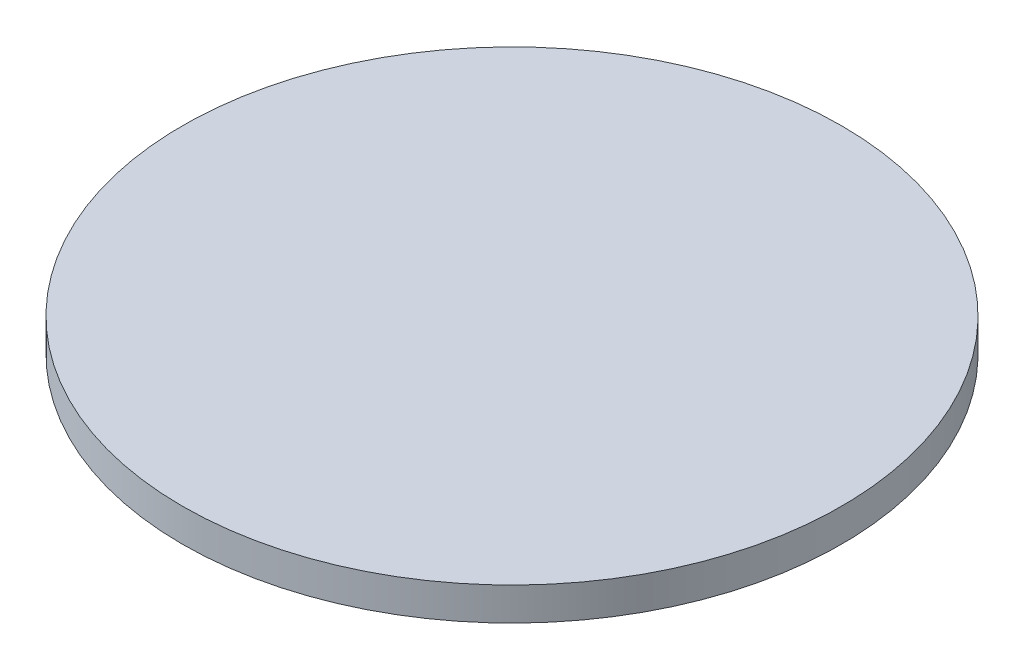
ISO-10303-21;
HEADER;
FILE_DESCRIPTION(('STEP AP214'),'2;1');
FILE_NAME('part.step','',(''),(''),'','','');
FILE_SCHEMA(('AUTOMOTIVE_DESIGN { 1 0 10303 214 1 1 1 1 }'));
ENDSEC;
DATA;
#1=APPLICATION_CONTEXT('core data for automotive mechanical design processes');
#2=APPLICATION_PROTOCOL_DEFINITION('international standard','automotive_design',2000,#1);
#3=PRODUCT_CONTEXT('',#1,'mechanical');
#4=PRODUCT('Part','Part','',(#3));
#5=PRODUCT_RELATED_PRODUCT_CATEGORY('part','',(#4));
#6=PRODUCT_DEFINITION_FORMATION('','',#4);
#7=PRODUCT_DEFINITION_CONTEXT('part definition',#1,'design');
#8=PRODUCT_DEFINITION('design','',#6,#7);
#9=PRODUCT_DEFINITION_SHAPE('','',#8);
#10=(LENGTH_UNIT() NAMED_UNIT(*) SI_UNIT(.MILLI.,.METRE.));
#11=(NAMED_UNIT(*) PLANE_ANGLE_UNIT() SI_UNIT($,.RADIAN.));
#12=(NAMED_UNIT(*) SI_UNIT($,.STERADIAN.) SOLID_ANGLE_UNIT());
#13=UNCERTAINTY_MEASURE_WITH_UNIT(LENGTH_MEASURE(1.E-05),#10,'distance_accuracy_value','');
#14=(GEOMETRIC_REPRESENTATION_CONTEXT(3) GLOBAL_UNCERTAINTY_ASSIGNED_CONTEXT((#13)) GLOBAL_UNIT_ASSIGNED_CONTEXT((#10,
#11,#12)) REPRESENTATION_CONTEXT('',''));
#15=CARTESIAN_POINT('',(0.,0.,0.));
#16=DIRECTION('',(0.,0.,1.));
#17=DIRECTION('',(1.,0.,0.));
#18=AXIS2_PLACEMENT_3D('',#15,#16,#17);
#19=CARTESIAN_POINT('',(0.,1.5,0.));
#20=DIRECTION('',(0.,-1.,0.));
#21=DIRECTION('',(0.,0.,-1.));
#22=AXIS2_PLACEMENT_3D('',#19,#20,#21);
#23=CYLINDRICAL_SURFACE('',#22,15.);
#24=CARTESIAN_POINT('',(0.,1.5,0.));
#25=DIRECTION('',(0.,1.,0.));
#26=DIRECTION('',(0.,0.,1.));
#27=AXIS2_PLACEMENT_3D('',#24,#25,#26);
#28=CIRCLE('',#27,15.);
#29=CARTESIAN_POINT('',(0.,1.5,15.));
#30=VERTEX_POINT('',#29);
#31=EDGE_CURVE('E10',#30,#30,#28,.T.);
#32=ORIENTED_EDGE('',*,*,#31,.F.);
#33=EDGE_LOOP('',(#32));
#34=FACE_BOUND('',#33,.T.);
#35=CARTESIAN_POINT('',(0.,0.,0.));
#36=DIRECTION('',(0.,1.,0.));
#37=DIRECTION('',(0.,0.,1.));
#38=AXIS2_PLACEMENT_3D('',#35,#36,#37);
#39=CIRCLE('',#38,15.);
#40=CARTESIAN_POINT('',(0.,0.,15.));
#41=VERTEX_POINT('',#40);
#42=EDGE_CURVE('E40',#41,#41,#39,.T.);
#43=ORIENTED_EDGE('',*,*,#42,.T.);
#44=EDGE_LOOP('',(#43));
#45=FACE_BOUND('',#44,.T.);
#46=ADVANCED_FACE('F37',(#34,#45),#23,.T.);
#47=CARTESIAN_POINT('',(0.,1.5,0.));
#48=DIRECTION('',(0.,1.,0.));
#49=DIRECTION('',(0.,0.,1.));
#50=AXIS2_PLACEMENT_3D('',#47,#48,#49);
#51=PLANE('',#50);
#52=ORIENTED_EDGE('',*,*,#31,.T.);
#53=EDGE_LOOP('',(#52));
#54=FACE_BOUND('',#53,.T.);
#55=ADVANCED_FACE('F70',(#54),#51,.T.);
#56=CARTESIAN_POINT('',(0.,0.,0.));
#57=DIRECTION('',(0.,1.,0.));
#58=DIRECTION('',(0.,0.,1.));
#59=AXIS2_PLACEMENT_3D('',#56,#57,#58);
#60=PLANE('',#59);
#61=CARTESIAN_POINT('',(0.,0.,0.));
#62=DIRECTION('',(0.,-1.,0.));
#63=DIRECTION('',(0.,0.,-1.));
#64=AXIS2_PLACEMENT_3D('',#61,#62,#63);
#65=CIRCLE('',#64,10.);
#66=CARTESIAN_POINT('',(0.,0.,-10.));
#67=VERTEX_POINT('',#66);
#68=EDGE_CURVE('E51',#67,#67,#65,.T.);
#69=ORIENTED_EDGE('',*,*,#68,.F.);
#70=EDGE_LOOP('',(#69));
#71=FACE_BOUND('',#70,.T.);
#72=ORIENTED_EDGE('',*,*,#42,.F.);
#73=EDGE_LOOP('',(#72));
#74=FACE_BOUND('',#73,.T.);
#75=ADVANCED_FACE('F64',(#71,#74),#60,.F.);
#76=CARTESIAN_POINT('',(0.,0.5,0.));
#77=DIRECTION('',(0.,-1.,0.));
#78=DIRECTION('',(0.,0.,-1.));
#79=AXIS2_PLACEMENT_3D('',#76,#77,#78);
#80=CYLINDRICAL_SURFACE('',#79,10.);
#81=CARTESIAN_POINT('',(0.,0.5,0.));
#82=DIRECTION('',(0.,-1.,0.));
#83=DIRECTION('',(0.,0.,-1.));
#84=AXIS2_PLACEMENT_3D('',#81,#82,#83);
#85=CIRCLE('',#84,10.);
#86=CARTESIAN_POINT('',(0.,0.5,-10.));
#87=VERTEX_POINT('',#86);
#88=EDGE_CURVE('E49',#87,#87,#85,.T.);
#89=ORIENTED_EDGE('',*,*,#88,.F.);
#90=EDGE_LOOP('',(#89));
#91=FACE_BOUND('',#90,.T.);
#92=ORIENTED_EDGE('',*,*,#68,.T.);
#93=EDGE_LOOP('',(#92));
#94=FACE_BOUND('',#93,.T.);
#95=ADVANCED_FACE('F61',(#91,#94),#80,.F.);
#96=CARTESIAN_POINT('',(0.,0.5,0.));
#97=DIRECTION('',(0.,-1.,0.));
#98=DIRECTION('',(0.,0.,-1.));
#99=AXIS2_PLACEMENT_3D('',#96,#97,#98);
#100=PLANE('',#99);
#101=ORIENTED_EDGE('',*,*,#88,.T.);
#102=EDGE_LOOP('',(#101));
#103=FACE_BOUND('',#102,.T.);
#104=ADVANCED_FACE('F59',(#103),#100,.T.);
#105=CLOSED_SHELL('',(#46,#55,#75,#95,#104));
#106=MANIFOLD_SOLID_BREP('B2',#105);
#107=ADVANCED_BREP_SHAPE_REPRESENTATION('',(#18,#106),#14);
#108=SHAPE_DEFINITION_REPRESENTATION(#9,#107);
ENDSEC;
END-ISO-10303-21;
